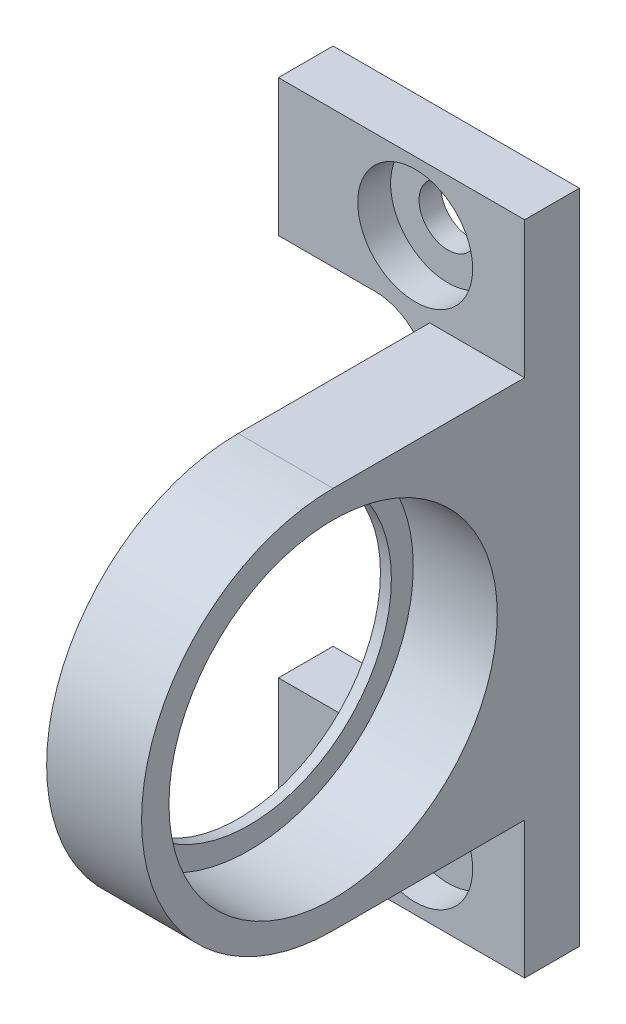
ISO-10303-21;
HEADER;
FILE_DESCRIPTION(('STEP AP214'),'2;1');
FILE_NAME('part.step','',(''),(''),'','','');
FILE_SCHEMA(('AUTOMOTIVE_DESIGN { 1 0 10303 214 1 1 1 1 }'));
ENDSEC;
DATA;
#1=APPLICATION_CONTEXT('core data for automotive mechanical design processes');
#2=APPLICATION_PROTOCOL_DEFINITION('international standard','automotive_design',2000,#1);
#3=PRODUCT_CONTEXT('',#1,'mechanical');
#4=PRODUCT('Part','Part','',(#3));
#5=PRODUCT_RELATED_PRODUCT_CATEGORY('part','',(#4));
#6=PRODUCT_DEFINITION_FORMATION('','',#4);
#7=PRODUCT_DEFINITION_CONTEXT('part definition',#1,'design');
#8=PRODUCT_DEFINITION('design','',#6,#7);
#9=PRODUCT_DEFINITION_SHAPE('','',#8);
#10=(LENGTH_UNIT() NAMED_UNIT(*) SI_UNIT(.MILLI.,.METRE.));
#11=(NAMED_UNIT(*) PLANE_ANGLE_UNIT() SI_UNIT($,.RADIAN.));
#12=(NAMED_UNIT(*) SI_UNIT($,.STERADIAN.) SOLID_ANGLE_UNIT());
#13=UNCERTAINTY_MEASURE_WITH_UNIT(LENGTH_MEASURE(1.E-05),#10,'distance_accuracy_value','');
#14=(GEOMETRIC_REPRESENTATION_CONTEXT(3) GLOBAL_UNCERTAINTY_ASSIGNED_CONTEXT((#13)) GLOBAL_UNIT_ASSIGNED_CONTEXT((#10,
#11,#12)) REPRESENTATION_CONTEXT('',''));
#15=CARTESIAN_POINT('',(0.,0.,0.));
#16=DIRECTION('',(0.,0.,1.));
#17=DIRECTION('',(1.,0.,0.));
#18=AXIS2_PLACEMENT_3D('',#15,#16,#17);
#19=CARTESIAN_POINT('',(7.72642356527553,24.3382352941177,-0.00999999999999959));
#20=DIRECTION('',(-1.,0.,0.));
#21=DIRECTION('',(0.,-1.,0.));
#22=AXIS2_PLACEMENT_3D('',#19,#20,#21);
#23=PLANE('',#22);
#24=DIRECTION('',(0.,-1.,0.));
#25=VECTOR('',#24,1.);
#26=CARTESIAN_POINT('',(7.72642356527553,0.,5.));
#27=LINE('',#26,#25);
#28=CARTESIAN_POINT('',(7.72642356527553,24.3382352941177,5.));
#29=VERTEX_POINT('',#28);
#30=CARTESIAN_POINT('',(7.72642356527553,11.8382352941177,5.));
#31=VERTEX_POINT('',#30);
#32=EDGE_CURVE('E229',#29,#31,#27,.T.);
#33=ORIENTED_EDGE('',*,*,#32,.F.);
#34=DIRECTION('',(0.,0.,-1.));
#35=VECTOR('',#34,1.);
#36=CARTESIAN_POINT('',(7.72642356527553,24.3382352941177,5.));
#37=LINE('',#36,#35);
#38=CARTESIAN_POINT('',(7.72642356527552,24.3382352941177,0.));
#39=VERTEX_POINT('',#38);
#40=EDGE_CURVE('E179',#29,#39,#37,.T.);
#41=ORIENTED_EDGE('',*,*,#40,.T.);
#42=DIRECTION('',(0.,-1.,0.));
#43=VECTOR('',#42,1.);
#44=CARTESIAN_POINT('',(7.72642356527553,0.,0.));
#45=LINE('',#44,#43);
#46=CARTESIAN_POINT('',(7.72642356527552,11.8382352941177,0.));
#47=VERTEX_POINT('',#46);
#48=EDGE_CURVE('E180',#39,#47,#45,.T.);
#49=ORIENTED_EDGE('',*,*,#48,.T.);
#50=DIRECTION('',(0.,0.,1.));
#51=VECTOR('',#50,1.);
#52=CARTESIAN_POINT('',(7.72642356527553,11.8382352941177,5.));
#53=LINE('',#52,#51);
#54=EDGE_CURVE('E232',#47,#31,#53,.T.);
#55=ORIENTED_EDGE('',*,*,#54,.T.);
#56=EDGE_LOOP('',(#33,#41,#49,#55));
#57=FACE_BOUND('',#56,.T.);
#58=ADVANCED_FACE('F53',(#57),#23,.T.);
#59=DIRECTION('',(0.,-1.,0.));
#60=VECTOR('',#59,1.);
#61=CARTESIAN_POINT('',(7.72642356527553,0.,5.));
#62=LINE('',#61,#60);
#63=CARTESIAN_POINT('',(7.72642356527552,-23.1617647058823,5.));
#64=VERTEX_POINT('',#63);
#65=CARTESIAN_POINT('',(7.72642356527552,-35.6617647058823,5.));
#66=VERTEX_POINT('',#65);
#67=EDGE_CURVE('E226',#64,#66,#62,.T.);
#68=ORIENTED_EDGE('',*,*,#67,.F.);
#69=DIRECTION('',(0.,0.,-1.));
#70=VECTOR('',#69,1.);
#71=CARTESIAN_POINT('',(7.72642356527552,-23.1617647058823,5.));
#72=LINE('',#71,#70);
#73=CARTESIAN_POINT('',(7.72642356527552,-23.1617647058823,0.));
#74=VERTEX_POINT('',#73);
#75=EDGE_CURVE('E185',#64,#74,#72,.T.);
#76=ORIENTED_EDGE('',*,*,#75,.T.);
#77=CARTESIAN_POINT('',(7.72642356527552,-35.6617647058823,0.));
#78=VERTEX_POINT('',#77);
#79=EDGE_CURVE('E162',#74,#78,#45,.T.);
#80=ORIENTED_EDGE('',*,*,#79,.T.);
#81=DIRECTION('',(0.,0.,1.));
#82=VECTOR('',#81,1.);
#83=CARTESIAN_POINT('',(7.72642356527552,-35.6617647058823,5.));
#84=LINE('',#83,#82);
#85=EDGE_CURVE('E173',#78,#66,#84,.T.);
#86=ORIENTED_EDGE('',*,*,#85,.T.);
#87=EDGE_LOOP('',(#68,#76,#80,#86));
#88=FACE_BOUND('',#87,.T.);
#89=ADVANCED_FACE('F183',(#88),#23,.T.);
#90=CARTESIAN_POINT('',(0.,0.,5.));
#91=DIRECTION('',(0.,0.,1.));
#92=DIRECTION('',(1.,0.,0.));
#93=AXIS2_PLACEMENT_3D('',#90,#91,#92);
#94=PLANE('',#93);
#95=CARTESIAN_POINT('',(20.2264235652755,18.0882352941177,5.));
#96=DIRECTION('',(0.,0.,1.));
#97=DIRECTION('',(1.,0.,0.));
#98=AXIS2_PLACEMENT_3D('',#95,#96,#97);
#99=CIRCLE('',#98,5.25);
#100=CARTESIAN_POINT('',(25.4764235652755,18.0882352941177,5.));
#101=VERTEX_POINT('',#100);
#102=EDGE_CURVE('E559',#101,#101,#99,.T.);
#103=ORIENTED_EDGE('',*,*,#102,.F.);
#104=EDGE_LOOP('',(#103));
#105=FACE_BOUND('',#104,.T.);
#106=DIRECTION('',(-1.,0.,0.));
#107=VECTOR('',#106,1.);
#108=CARTESIAN_POINT('',(0.,24.3382352941177,5.));
#109=LINE('',#108,#107);
#110=CARTESIAN_POINT('',(30.2264235652755,24.3382352941177,5.));
#111=VERTEX_POINT('',#110);
#112=EDGE_CURVE('E200',#111,#29,#109,.T.);
#113=ORIENTED_EDGE('',*,*,#112,.T.);
#114=ORIENTED_EDGE('',*,*,#32,.T.);
#115=DIRECTION('',(1.,0.,0.));
#116=VECTOR('',#115,1.);
#117=CARTESIAN_POINT('',(0.,11.8382352941177,5.));
#118=LINE('',#117,#116);
#119=CARTESIAN_POINT('',(16.5499529770402,11.8382352941177,5.));
#120=VERTEX_POINT('',#119);
#121=EDGE_CURVE('E196',#31,#120,#118,.T.);
#122=ORIENTED_EDGE('',*,*,#121,.T.);
#123=CARTESIAN_POINT('',(16.5499529770402,6.83823529411772,5.));
#124=DIRECTION('',(0.,0.,1.));
#125=DIRECTION('',(1.,0.,0.));
#126=AXIS2_PLACEMENT_3D('',#123,#124,#125);
#127=CIRCLE('',#126,5.);
#128=CARTESIAN_POINT('',(21.5499529770402,6.83823529411772,5.));
#129=VERTEX_POINT('',#128);
#130=EDGE_CURVE('E289',#120,#129,#127,.F.);
#131=ORIENTED_EDGE('',*,*,#130,.T.);
#132=DIRECTION('',(0.,-1.,0.));
#133=VECTOR('',#132,1.);
#134=CARTESIAN_POINT('',(21.5499529770402,0.,5.));
#135=LINE('',#134,#133);
#136=CARTESIAN_POINT('',(21.5499529770402,11.8382352941177,5.));
#137=VERTEX_POINT('',#136);
#138=EDGE_CURVE('E288',#137,#129,#135,.T.);
#139=ORIENTED_EDGE('',*,*,#138,.F.);
#140=DIRECTION('',(-1.,0.,0.));
#141=VECTOR('',#140,1.);
#142=CARTESIAN_POINT('',(30.2264235652755,11.8382352941177,5.));
#143=LINE('',#142,#141);
#144=CARTESIAN_POINT('',(30.2264235652755,11.8382352941177,5.));
#145=VERTEX_POINT('',#144);
#146=EDGE_CURVE('E214',#145,#137,#143,.T.);
#147=ORIENTED_EDGE('',*,*,#146,.F.);
#148=DIRECTION('',(0.,-1.,0.));
#149=VECTOR('',#148,1.);
#150=CARTESIAN_POINT('',(30.2264235652755,0.,5.));
#151=LINE('',#150,#149);
#152=EDGE_CURVE('E202',#111,#145,#151,.T.);
#153=ORIENTED_EDGE('',*,*,#152,.F.);
#154=EDGE_LOOP('',(#113,#114,#122,#131,#139,#147,#153));
#155=FACE_BOUND('',#154,.T.);
#156=ADVANCED_FACE('F252',(#105,#155),#94,.T.);
#157=CARTESIAN_POINT('',(20.2264235652755,-29.4117647058823,5.));
#158=DIRECTION('',(0.,0.,1.));
#159=DIRECTION('',(1.,0.,0.));
#160=AXIS2_PLACEMENT_3D('',#157,#158,#159);
#161=CIRCLE('',#160,5.25);
#162=CARTESIAN_POINT('',(25.4764235652755,-29.4117647058823,5.));
#163=VERTEX_POINT('',#162);
#164=EDGE_CURVE('E549',#163,#163,#161,.T.);
#165=ORIENTED_EDGE('',*,*,#164,.F.);
#166=EDGE_LOOP('',(#165));
#167=FACE_BOUND('',#166,.T.);
#168=DIRECTION('',(-1.,0.,0.));
#169=VECTOR('',#168,1.);
#170=CARTESIAN_POINT('',(0.,-23.1617647058823,5.));
#171=LINE('',#170,#169);
#172=CARTESIAN_POINT('',(16.5499529770402,-23.1617647058823,5.));
#173=VERTEX_POINT('',#172);
#174=EDGE_CURVE('E194',#173,#64,#171,.T.);
#175=ORIENTED_EDGE('',*,*,#174,.T.);
#176=ORIENTED_EDGE('',*,*,#67,.T.);
#177=DIRECTION('',(1.,0.,0.));
#178=VECTOR('',#177,1.);
#179=CARTESIAN_POINT('',(0.,-35.6617647058823,5.));
#180=LINE('',#179,#178);
#181=CARTESIAN_POINT('',(30.2264235652755,-35.6617647058823,5.));
#182=VERTEX_POINT('',#181);
#183=EDGE_CURVE('E175',#66,#182,#180,.T.);
#184=ORIENTED_EDGE('',*,*,#183,.T.);
#185=CARTESIAN_POINT('',(30.2264235652755,-23.1617647058823,5.));
#186=VERTEX_POINT('',#185);
#187=EDGE_CURVE('E206',#186,#182,#151,.T.);
#188=ORIENTED_EDGE('',*,*,#187,.F.);
#189=DIRECTION('',(1.,0.,0.));
#190=VECTOR('',#189,1.);
#191=CARTESIAN_POINT('',(30.2264235652755,-23.1617647058823,5.));
#192=LINE('',#191,#190);
#193=CARTESIAN_POINT('',(21.5499529770402,-23.1617647058823,5.));
#194=VERTEX_POINT('',#193);
#195=EDGE_CURVE('E217',#194,#186,#192,.T.);
#196=ORIENTED_EDGE('',*,*,#195,.F.);
#197=DIRECTION('',(0.,-1.,0.));
#198=VECTOR('',#197,1.);
#199=CARTESIAN_POINT('',(21.5499529770402,0.,5.));
#200=LINE('',#199,#198);
#201=CARTESIAN_POINT('',(21.5499529770402,-18.1617647058823,5.));
#202=VERTEX_POINT('',#201);
#203=EDGE_CURVE('E261',#202,#194,#200,.T.);
#204=ORIENTED_EDGE('',*,*,#203,.F.);
#205=CARTESIAN_POINT('',(16.5499529770402,-18.1617647058823,5.));
#206=DIRECTION('',(0.,0.,1.));
#207=DIRECTION('',(1.,0.,0.));
#208=AXIS2_PLACEMENT_3D('',#205,#206,#207);
#209=CIRCLE('',#208,5.);
#210=EDGE_CURVE('E569',#202,#173,#209,.F.);
#211=ORIENTED_EDGE('',*,*,#210,.T.);
#212=EDGE_LOOP('',(#175,#176,#184,#188,#196,#204,#211));
#213=FACE_BOUND('',#212,.T.);
#214=ADVANCED_FACE('F281',(#167,#213),#94,.T.);
#215=CARTESIAN_POINT('',(0.,11.8382352941177,5.));
#216=DIRECTION('',(0.,1.,0.));
#217=DIRECTION('',(-1.,0.,0.));
#218=AXIS2_PLACEMENT_3D('',#215,#216,#217);
#219=PLANE('',#218);
#220=ORIENTED_EDGE('',*,*,#54,.F.);
#221=DIRECTION('',(1.,0.,0.));
#222=VECTOR('',#221,1.);
#223=CARTESIAN_POINT('',(0.,11.8382352941177,0.));
#224=LINE('',#223,#222);
#225=CARTESIAN_POINT('',(16.5499529770402,11.8382352941177,0.));
#226=VERTEX_POINT('',#225);
#227=EDGE_CURVE('E170',#47,#226,#224,.T.);
#228=ORIENTED_EDGE('',*,*,#227,.T.);
#229=DIRECTION('',(0.,0.,-1.));
#230=VECTOR('',#229,1.);
#231=CARTESIAN_POINT('',(16.5499529770402,11.8382352941177,5.));
#232=LINE('',#231,#230);
#233=EDGE_CURVE('E249',#226,#120,#232,.F.);
#234=ORIENTED_EDGE('',*,*,#233,.T.);
#235=ORIENTED_EDGE('',*,*,#121,.F.);
#236=EDGE_LOOP('',(#220,#228,#234,#235));
#237=FACE_BOUND('',#236,.T.);
#238=ADVANCED_FACE('F248',(#237),#219,.F.);
#239=CARTESIAN_POINT('',(0.,-23.1617647058823,5.));
#240=DIRECTION('',(0.,-1.,0.));
#241=DIRECTION('',(1.,0.,0.));
#242=AXIS2_PLACEMENT_3D('',#239,#240,#241);
#243=PLANE('',#242);
#244=ORIENTED_EDGE('',*,*,#75,.F.);
#245=ORIENTED_EDGE('',*,*,#174,.F.);
#246=DIRECTION('',(0.,0.,-1.));
#247=VECTOR('',#246,1.);
#248=CARTESIAN_POINT('',(16.5499529770402,-23.1617647058823,5.));
#249=LINE('',#248,#247);
#250=CARTESIAN_POINT('',(16.5499529770402,-23.1617647058823,0.));
#251=VERTEX_POINT('',#250);
#252=EDGE_CURVE('E575',#173,#251,#249,.T.);
#253=ORIENTED_EDGE('',*,*,#252,.T.);
#254=DIRECTION('',(-1.,0.,0.));
#255=VECTOR('',#254,1.);
#256=CARTESIAN_POINT('',(0.,-23.1617647058823,0.));
#257=LINE('',#256,#255);
#258=EDGE_CURVE('E203',#251,#74,#257,.T.);
#259=ORIENTED_EDGE('',*,*,#258,.T.);
#260=EDGE_LOOP('',(#244,#245,#253,#259));
#261=FACE_BOUND('',#260,.T.);
#262=ADVANCED_FACE('F336',(#261),#243,.F.);
#263=CARTESIAN_POINT('',(0.,24.3382352941177,5.));
#264=DIRECTION('',(0.,-1.,0.));
#265=DIRECTION('',(0.,0.,-1.));
#266=AXIS2_PLACEMENT_3D('',#263,#264,#265);
#267=PLANE('',#266);
#268=ORIENTED_EDGE('',*,*,#40,.F.);
#269=ORIENTED_EDGE('',*,*,#112,.F.);
#270=DIRECTION('',(0.,0.,-1.));
#271=VECTOR('',#270,1.);
#272=CARTESIAN_POINT('',(30.2264235652755,24.3382352941177,5.));
#273=LINE('',#272,#271);
#274=CARTESIAN_POINT('',(30.2264235652755,24.3382352941177,0.));
#275=VERTEX_POINT('',#274);
#276=EDGE_CURVE('E257',#111,#275,#273,.T.);
#277=ORIENTED_EDGE('',*,*,#276,.T.);
#278=DIRECTION('',(-1.,0.,0.));
#279=VECTOR('',#278,1.);
#280=CARTESIAN_POINT('',(0.,24.3382352941177,0.));
#281=LINE('',#280,#279);
#282=EDGE_CURVE('E169',#275,#39,#281,.T.);
#283=ORIENTED_EDGE('',*,*,#282,.T.);
#284=EDGE_LOOP('',(#268,#269,#277,#283));
#285=FACE_BOUND('',#284,.T.);
#286=ADVANCED_FACE('F256',(#285),#267,.F.);
#287=CARTESIAN_POINT('',(0.,-35.6617647058823,5.));
#288=DIRECTION('',(0.,1.,0.));
#289=DIRECTION('',(0.,0.,1.));
#290=AXIS2_PLACEMENT_3D('',#287,#288,#289);
#291=PLANE('',#290);
#292=ORIENTED_EDGE('',*,*,#85,.F.);
#293=DIRECTION('',(1.,0.,0.));
#294=VECTOR('',#293,1.);
#295=CARTESIAN_POINT('',(0.,-35.6617647058823,0.));
#296=LINE('',#295,#294);
#297=CARTESIAN_POINT('',(30.2264235652755,-35.6617647058823,0.));
#298=VERTEX_POINT('',#297);
#299=EDGE_CURVE('E157',#78,#298,#296,.T.);
#300=ORIENTED_EDGE('',*,*,#299,.T.);
#301=DIRECTION('',(0.,0.,-1.));
#302=VECTOR('',#301,1.);
#303=CARTESIAN_POINT('',(30.2264235652755,-35.6617647058823,5.));
#304=LINE('',#303,#302);
#305=EDGE_CURVE('E197',#182,#298,#304,.T.);
#306=ORIENTED_EDGE('',*,*,#305,.F.);
#307=ORIENTED_EDGE('',*,*,#183,.F.);
#308=EDGE_LOOP('',(#292,#300,#306,#307));
#309=FACE_BOUND('',#308,.T.);
#310=ADVANCED_FACE('F174',(#309),#291,.F.);
#311=CARTESIAN_POINT('',(0.,0.,0.));
#312=DIRECTION('',(0.,0.,1.));
#313=DIRECTION('',(1.,0.,0.));
#314=AXIS2_PLACEMENT_3D('',#311,#312,#313);
#315=PLANE('',#314);
#316=CARTESIAN_POINT('',(20.2264235652755,-29.4117647058823,0.));
#317=DIRECTION('',(0.,0.,1.));
#318=DIRECTION('',(1.,0.,0.));
#319=AXIS2_PLACEMENT_3D('',#316,#317,#318);
#320=CIRCLE('',#319,2.65);
#321=CARTESIAN_POINT('',(22.8764235652755,-29.4117647058823,0.));
#322=VERTEX_POINT('',#321);
#323=EDGE_CURVE('E556',#322,#322,#320,.T.);
#324=ORIENTED_EDGE('',*,*,#323,.T.);
#325=EDGE_LOOP('',(#324));
#326=FACE_BOUND('',#325,.T.);
#327=CARTESIAN_POINT('',(20.2264235652755,18.0882352941177,0.));
#328=DIRECTION('',(0.,0.,1.));
#329=DIRECTION('',(1.,0.,0.));
#330=AXIS2_PLACEMENT_3D('',#327,#328,#329);
#331=CIRCLE('',#330,2.65);
#332=CARTESIAN_POINT('',(22.8764235652755,18.0882352941177,0.));
#333=VERTEX_POINT('',#332);
#334=EDGE_CURVE('E186',#333,#333,#331,.T.);
#335=ORIENTED_EDGE('',*,*,#334,.T.);
#336=EDGE_LOOP('',(#335));
#337=FACE_BOUND('',#336,.T.);
#338=ORIENTED_EDGE('',*,*,#48,.F.);
#339=ORIENTED_EDGE('',*,*,#282,.F.);
#340=DIRECTION('',(0.,-1.,0.));
#341=VECTOR('',#340,1.);
#342=CARTESIAN_POINT('',(30.2264235652755,0.,0.));
#343=LINE('',#342,#341);
#344=EDGE_CURVE('E165',#275,#298,#343,.T.);
#345=ORIENTED_EDGE('',*,*,#344,.T.);
#346=ORIENTED_EDGE('',*,*,#299,.F.);
#347=ORIENTED_EDGE('',*,*,#79,.F.);
#348=ORIENTED_EDGE('',*,*,#258,.F.);
#349=CARTESIAN_POINT('',(16.5499529770402,-18.1617647058823,0.));
#350=DIRECTION('',(0.,0.,1.));
#351=DIRECTION('',(1.,0.,0.));
#352=AXIS2_PLACEMENT_3D('',#349,#350,#351);
#353=CIRCLE('',#352,5.);
#354=CARTESIAN_POINT('',(21.5499529770402,-18.1617647058823,0.));
#355=VERTEX_POINT('',#354);
#356=EDGE_CURVE('E571',#251,#355,#353,.T.);
#357=ORIENTED_EDGE('',*,*,#356,.T.);
#358=DIRECTION('',(0.,1.,0.));
#359=VECTOR('',#358,1.);
#360=CARTESIAN_POINT('',(21.5499529770402,0.,0.));
#361=LINE('',#360,#359);
#362=CARTESIAN_POINT('',(21.5499529770402,6.83823529411772,0.));
#363=VERTEX_POINT('',#362);
#364=EDGE_CURVE('E205',#355,#363,#361,.T.);
#365=ORIENTED_EDGE('',*,*,#364,.T.);
#366=CARTESIAN_POINT('',(16.5499529770402,6.83823529411772,0.));
#367=DIRECTION('',(0.,0.,1.));
#368=DIRECTION('',(1.,0.,0.));
#369=AXIS2_PLACEMENT_3D('',#366,#367,#368);
#370=CIRCLE('',#369,5.);
#371=EDGE_CURVE('E244',#363,#226,#370,.T.);
#372=ORIENTED_EDGE('',*,*,#371,.T.);
#373=ORIENTED_EDGE('',*,*,#227,.F.);
#374=EDGE_LOOP('',(#338,#339,#345,#346,#347,#348,#357,#365,#372,#373));
#375=FACE_BOUND('',#374,.T.);
#376=ADVANCED_FACE('F55',(#326,#337,#375),#315,.F.);
#377=CARTESIAN_POINT('',(30.2264235652755,-5.66176470588227,22.5));
#378=DIRECTION('',(-1.,0.,0.));
#379=DIRECTION('',(0.,0.,1.));
#380=AXIS2_PLACEMENT_3D('',#377,#378,#379);
#381=CYLINDRICAL_SURFACE('',#380,15.);
#382=CARTESIAN_POINT('',(30.2264235652755,-5.66176470588227,22.5));
#383=DIRECTION('',(-1.,0.,0.));
#384=DIRECTION('',(0.,0.,1.));
#385=AXIS2_PLACEMENT_3D('',#382,#383,#384);
#386=CIRCLE('',#385,15.);
#387=CARTESIAN_POINT('',(30.2264235652755,-5.66176470588227,37.5));
#388=VERTEX_POINT('',#387);
#389=EDGE_CURVE('E221',#388,#388,#386,.T.);
#390=CARTESIAN_POINT('',(22.5499529770402,-5.66176470588227,22.5));
#391=DIRECTION('',(-1.,0.,0.));
#392=DIRECTION('',(0.,0.,1.));
#393=AXIS2_PLACEMENT_3D('',#390,#391,#392);
#394=CIRCLE('',#393,15.);
#395=CARTESIAN_POINT('',(22.5499529770402,-5.66176470588227,37.5));
#396=VERTEX_POINT('',#395);
#397=EDGE_CURVE('E228',#396,#396,#394,.F.);
#398=CARTESIAN_POINT('',(30.2264235652755,-5.66176470588227,37.5));
#399=CARTESIAN_POINT('',(30.1464603299814,-5.66176470588227,37.5));
#400=CARTESIAN_POINT('',(30.0664970946873,-5.66176470588227,37.5));
#401=CARTESIAN_POINT('',(29.9065706240991,-5.66176470588227,37.5));
#402=CARTESIAN_POINT('',(29.8266073888049,-5.66176470588227,37.5));
#403=CARTESIAN_POINT('',(29.6666809182167,-5.66176470588227,37.5));
#404=CARTESIAN_POINT('',(29.5867176829226,-5.66176470588227,37.5));
#405=CARTESIAN_POINT('',(29.4267912123343,-5.66176470588227,37.5));
#406=CARTESIAN_POINT('',(29.3468279770402,-5.66176470588227,37.5));
#407=CARTESIAN_POINT('',(29.186901506452,-5.66176470588227,37.5));
#408=CARTESIAN_POINT('',(29.1069382711579,-5.66176470588227,37.5));
#409=CARTESIAN_POINT('',(28.9470118005696,-5.66176470588227,37.5));
#410=CARTESIAN_POINT('',(28.8670485652755,-5.66176470588227,37.5));
#411=CARTESIAN_POINT('',(28.7071220946873,-5.66176470588227,37.5));
#412=CARTESIAN_POINT('',(28.6271588593932,-5.66176470588227,37.5));
#413=CARTESIAN_POINT('',(28.4672323888049,-5.66176470588227,37.5));
#414=CARTESIAN_POINT('',(28.3872691535108,-5.66176470588227,37.5));
#415=CARTESIAN_POINT('',(28.2273426829226,-5.66176470588227,37.5));
#416=CARTESIAN_POINT('',(28.1473794476285,-5.66176470588227,37.5));
#417=CARTESIAN_POINT('',(27.9874529770402,-5.66176470588227,37.5));
#418=CARTESIAN_POINT('',(27.9074897417461,-5.66176470588227,37.5));
#419=CARTESIAN_POINT('',(27.7475632711579,-5.66176470588227,37.5));
#420=CARTESIAN_POINT('',(27.6676000358638,-5.66176470588227,37.5));
#421=CARTESIAN_POINT('',(27.5076735652755,-5.66176470588227,37.5));
#422=CARTESIAN_POINT('',(27.4277103299814,-5.66176470588227,37.5));
#423=CARTESIAN_POINT('',(27.2677838593932,-5.66176470588227,37.5));
#424=CARTESIAN_POINT('',(27.187820624099,-5.66176470588227,37.5));
#425=CARTESIAN_POINT('',(27.0278941535108,-5.66176470588227,37.5));
#426=CARTESIAN_POINT('',(26.9479309182167,-5.66176470588227,37.5));
#427=CARTESIAN_POINT('',(26.7880044476285,-5.66176470588227,37.5));
#428=CARTESIAN_POINT('',(26.7080412123343,-5.66176470588227,37.5));
#429=CARTESIAN_POINT('',(26.5481147417461,-5.66176470588227,37.5));
#430=CARTESIAN_POINT('',(26.468151506452,-5.66176470588227,37.5));
#431=CARTESIAN_POINT('',(26.3082250358637,-5.66176470588227,37.5));
#432=CARTESIAN_POINT('',(26.2282618005696,-5.66176470588227,37.5));
#433=CARTESIAN_POINT('',(26.0683353299814,-5.66176470588227,37.5));
#434=CARTESIAN_POINT('',(25.9883720946873,-5.66176470588227,37.5));
#435=CARTESIAN_POINT('',(25.828445624099,-5.66176470588227,37.5));
#436=CARTESIAN_POINT('',(25.7484823888049,-5.66176470588227,37.5));
#437=CARTESIAN_POINT('',(25.5885559182167,-5.66176470588227,37.5));
#438=CARTESIAN_POINT('',(25.5085926829226,-5.66176470588227,37.5));
#439=CARTESIAN_POINT('',(25.3486662123343,-5.66176470588227,37.5));
#440=CARTESIAN_POINT('',(25.2687029770402,-5.66176470588227,37.5));
#441=CARTESIAN_POINT('',(25.108776506452,-5.66176470588227,37.5));
#442=CARTESIAN_POINT('',(25.0288132711579,-5.66176470588227,37.5));
#443=CARTESIAN_POINT('',(24.8688868005696,-5.66176470588227,37.5));
#444=CARTESIAN_POINT('',(24.7889235652755,-5.66176470588227,37.5));
#445=CARTESIAN_POINT('',(24.6289970946873,-5.66176470588227,37.5));
#446=CARTESIAN_POINT('',(24.5490338593932,-5.66176470588227,37.5));
#447=CARTESIAN_POINT('',(24.3891073888049,-5.66176470588227,37.5));
#448=CARTESIAN_POINT('',(24.3091441535108,-5.66176470588227,37.5));
#449=CARTESIAN_POINT('',(24.1492176829226,-5.66176470588227,37.5));
#450=CARTESIAN_POINT('',(24.0692544476284,-5.66176470588227,37.5));
#451=CARTESIAN_POINT('',(23.9093279770402,-5.66176470588227,37.5));
#452=CARTESIAN_POINT('',(23.8293647417461,-5.66176470588227,37.5));
#453=CARTESIAN_POINT('',(23.6694382711579,-5.66176470588227,37.5));
#454=CARTESIAN_POINT('',(23.5894750358637,-5.66176470588227,37.5));
#455=CARTESIAN_POINT('',(23.4295485652755,-5.66176470588227,37.5));
#456=CARTESIAN_POINT('',(23.3495853299814,-5.66176470588227,37.5));
#457=CARTESIAN_POINT('',(23.1896588593932,-5.66176470588227,37.5));
#458=CARTESIAN_POINT('',(23.109695624099,-5.66176470588227,37.5));
#459=CARTESIAN_POINT('',(22.9497691535108,-5.66176470588227,37.5));
#460=CARTESIAN_POINT('',(22.8698059182167,-5.66176470588227,37.5));
#461=CARTESIAN_POINT('',(22.7098794476284,-5.66176470588227,37.5));
#462=CARTESIAN_POINT('',(22.6299162123343,-5.66176470588227,37.5));
#463=CARTESIAN_POINT('',(22.5499529770402,-5.66176470588227,37.5));
#464=B_SPLINE_CURVE_WITH_KNOTS('',3,(#398,#399,#400,#401,#402,#403,#404,#405,#406,#407,#408,
#409,#410,#411,#412,#413,#414,#415,#416,#417,#418,#419,#420,#421,#422,#423,#424,#425,#426,#427,
#428,#429,#430,#431,#432,#433,#434,#435,#436,#437,#438,#439,#440,#441,#442,#443,#444,#445,#446,
#447,#448,#449,#450,#451,#452,#453,#454,#455,#456,#457,#458,#459,#460,#461,#462,#463),
.UNSPECIFIED.,.F.,.F.,(4,2,2,2,2,2,2,2,2,2,2,2,2,2,2,2,2,2,2,2,2,2,2,2,2,2,2,2,2,2,2,2,4),(0.,
0.239889705882356,0.479779411764709,0.719669117647061,0.959558823529414,1.19944852941177,
1.43933823529412,1.67922794117648,1.91911764705883,2.15900735294118,2.39889705882354,
2.63878676470589,2.87867647058824,3.1185661764706,3.35845588235295,3.5983455882353,
3.83823529411766,4.07812500000001,4.31801470588236,4.55790441176472,4.79779411764707,
5.03768382352942,5.27757352941178,5.51746323529413,5.75735294117648,5.99724264705884,
6.23713235294119,6.47702205882355,6.7169117647059,6.95680147058825,7.19669117647061,
7.43658088235296,7.67647058823531),.UNSPECIFIED.);
#465=EDGE_CURVE('BSEAM298',#388,#396,#464,.T.);
#466=ORIENTED_EDGE('',*,*,#389,.F.);
#467=ORIENTED_EDGE('',*,*,#397,.F.);
#468=ORIENTED_EDGE('',*,*,#465,.T.);
#469=ORIENTED_EDGE('',*,*,#465,.F.);
#470=EDGE_LOOP('',(#466,#468,#467,#469));
#471=FACE_BOUND('',#470,.T.);
#472=ADVANCED_FACE('F298',(#471),#381,.F.);
#473=CARTESIAN_POINT('',(21.5499529770402,0.,5.));
#474=DIRECTION('',(-1.,0.,0.));
#475=DIRECTION('',(0.,0.,1.));
#476=AXIS2_PLACEMENT_3D('',#473,#474,#475);
#477=PLANE('',#476);
#478=ORIENTED_EDGE('',*,*,#138,.T.);
#479=DIRECTION('',(0.,0.,-1.));
#480=VECTOR('',#479,1.);
#481=CARTESIAN_POINT('',(21.5499529770402,6.83823529411772,5.));
#482=LINE('',#481,#480);
#483=EDGE_CURVE('E293',#129,#363,#482,.T.);
#484=ORIENTED_EDGE('',*,*,#483,.T.);
#485=ORIENTED_EDGE('',*,*,#364,.F.);
#486=DIRECTION('',(0.,0.,-1.));
#487=VECTOR('',#486,1.);
#488=CARTESIAN_POINT('',(21.5499529770402,-18.1617647058823,5.));
#489=LINE('',#488,#487);
#490=EDGE_CURVE('E292',#355,#202,#489,.F.);
#491=ORIENTED_EDGE('',*,*,#490,.T.);
#492=ORIENTED_EDGE('',*,*,#203,.T.);
#493=DIRECTION('',(0.,0.,-1.));
#494=VECTOR('',#493,1.);
#495=CARTESIAN_POINT('',(21.5499529770402,-23.1617647058823,40.));
#496=LINE('',#495,#494);
#497=CARTESIAN_POINT('',(21.5499529770402,-23.1617647058823,22.5));
#498=VERTEX_POINT('',#497);
#499=EDGE_CURVE('E272',#498,#194,#496,.T.);
#500=ORIENTED_EDGE('',*,*,#499,.F.);
#501=CARTESIAN_POINT('',(21.5499529770402,-5.66176470588227,22.5));
#502=DIRECTION('',(-1.,0.,0.));
#503=DIRECTION('',(0.,0.,1.));
#504=AXIS2_PLACEMENT_3D('',#501,#502,#503);
#505=CIRCLE('',#504,17.5);
#506=CARTESIAN_POINT('',(21.5499529770402,11.8382352941177,22.5));
#507=VERTEX_POINT('',#506);
#508=EDGE_CURVE('E78',#498,#507,#505,.T.);
#509=ORIENTED_EDGE('',*,*,#508,.T.);
#510=DIRECTION('',(0.,0.,-1.));
#511=VECTOR('',#510,1.);
#512=CARTESIAN_POINT('',(21.5499529770402,11.8382352941177,40.));
#513=LINE('',#512,#511);
#514=EDGE_CURVE('E270',#507,#137,#513,.T.);
#515=ORIENTED_EDGE('',*,*,#514,.T.);
#516=EDGE_LOOP('',(#478,#484,#485,#491,#492,#500,#509,#515));
#517=FACE_BOUND('',#516,.T.);
#518=CARTESIAN_POINT('',(21.5499529770402,-5.66176470588227,22.5));
#519=DIRECTION('',(-1.,0.,0.));
#520=DIRECTION('',(0.,0.,1.));
#521=AXIS2_PLACEMENT_3D('',#518,#519,#520);
#522=CIRCLE('',#521,13.);
#523=CARTESIAN_POINT('',(21.5499529770402,-5.66176470588227,35.5));
#524=VERTEX_POINT('',#523);
#525=EDGE_CURVE('E12',#524,#524,#522,.T.);
#526=ORIENTED_EDGE('',*,*,#525,.F.);
#527=EDGE_LOOP('',(#526));
#528=FACE_BOUND('',#527,.T.);
#529=ADVANCED_FACE('F295',(#517,#528),#477,.T.);
#530=CARTESIAN_POINT('',(30.2264235652755,0.,5.));
#531=DIRECTION('',(1.,0.,0.));
#532=DIRECTION('',(0.,0.,-1.));
#533=AXIS2_PLACEMENT_3D('',#530,#531,#532);
#534=PLANE('',#533);
#535=ORIENTED_EDGE('',*,*,#389,.T.);
#536=EDGE_LOOP('',(#535));
#537=FACE_BOUND('',#536,.T.);
#538=DIRECTION('',(0.,0.,-1.));
#539=VECTOR('',#538,1.);
#540=CARTESIAN_POINT('',(30.2264235652755,11.8382352941177,40.));
#541=LINE('',#540,#539);
#542=CARTESIAN_POINT('',(30.2264235652755,11.8382352941177,22.5));
#543=VERTEX_POINT('',#542);
#544=EDGE_CURVE('E267',#543,#145,#541,.T.);
#545=ORIENTED_EDGE('',*,*,#544,.F.);
#546=CARTESIAN_POINT('',(30.2264235652755,-5.66176470588227,22.5));
#547=DIRECTION('',(-1.,0.,0.));
#548=DIRECTION('',(0.,0.,1.));
#549=AXIS2_PLACEMENT_3D('',#546,#547,#548);
#550=CIRCLE('',#549,17.5);
#551=CARTESIAN_POINT('',(30.2264235652755,-23.1617647058823,22.5));
#552=VERTEX_POINT('',#551);
#553=EDGE_CURVE('E70',#552,#543,#550,.T.);
#554=ORIENTED_EDGE('',*,*,#553,.F.);
#555=DIRECTION('',(0.,0.,-1.));
#556=VECTOR('',#555,1.);
#557=CARTESIAN_POINT('',(30.2264235652755,-23.1617647058823,40.));
#558=LINE('',#557,#556);
#559=EDGE_CURVE('E274',#552,#186,#558,.T.);
#560=ORIENTED_EDGE('',*,*,#559,.T.);
#561=ORIENTED_EDGE('',*,*,#187,.T.);
#562=ORIENTED_EDGE('',*,*,#305,.T.);
#563=ORIENTED_EDGE('',*,*,#344,.F.);
#564=ORIENTED_EDGE('',*,*,#276,.F.);
#565=ORIENTED_EDGE('',*,*,#152,.T.);
#566=EDGE_LOOP('',(#545,#554,#560,#561,#562,#563,#564,#565));
#567=FACE_BOUND('',#566,.T.);
#568=ADVANCED_FACE('F283',(#537,#567),#534,.T.);
#569=CARTESIAN_POINT('',(30.2264235652755,11.8382352941177,40.));
#570=DIRECTION('',(0.,-1.,0.));
#571=DIRECTION('',(0.,0.,-1.));
#572=AXIS2_PLACEMENT_3D('',#569,#570,#571);
#573=PLANE('',#572);
#574=DIRECTION('',(-1.,0.,0.));
#575=VECTOR('',#574,1.);
#576=CARTESIAN_POINT('',(30.2264235652755,11.8382352941177,22.5));
#577=LINE('',#576,#575);
#578=EDGE_CURVE('E57',#543,#507,#577,.T.);
#579=ORIENTED_EDGE('',*,*,#578,.F.);
#580=ORIENTED_EDGE('',*,*,#544,.T.);
#581=ORIENTED_EDGE('',*,*,#146,.T.);
#582=ORIENTED_EDGE('',*,*,#514,.F.);
#583=EDGE_LOOP('',(#579,#580,#581,#582));
#584=FACE_BOUND('',#583,.T.);
#585=ADVANCED_FACE('F285',(#584),#573,.F.);
#586=CARTESIAN_POINT('',(30.2264235652755,-23.1617647058823,40.));
#587=DIRECTION('',(0.,1.,0.));
#588=DIRECTION('',(0.,0.,1.));
#589=AXIS2_PLACEMENT_3D('',#586,#587,#588);
#590=PLANE('',#589);
#591=ORIENTED_EDGE('',*,*,#559,.F.);
#592=DIRECTION('',(-1.,0.,0.));
#593=VECTOR('',#592,1.);
#594=CARTESIAN_POINT('',(30.2264235652755,-23.1617647058823,22.5));
#595=LINE('',#594,#593);
#596=EDGE_CURVE('E208',#552,#498,#595,.T.);
#597=ORIENTED_EDGE('',*,*,#596,.T.);
#598=ORIENTED_EDGE('',*,*,#499,.T.);
#599=ORIENTED_EDGE('',*,*,#195,.T.);
#600=EDGE_LOOP('',(#591,#597,#598,#599));
#601=FACE_BOUND('',#600,.T.);
#602=ADVANCED_FACE('F278',(#601),#590,.F.);
#603=CARTESIAN_POINT('',(30.2264235652755,-5.66176470588227,22.5));
#604=DIRECTION('',(-1.,0.,0.));
#605=DIRECTION('',(0.,0.,1.));
#606=AXIS2_PLACEMENT_3D('',#603,#604,#605);
#607=CYLINDRICAL_SURFACE('',#606,17.5);
#608=ORIENTED_EDGE('',*,*,#596,.F.);
#609=ORIENTED_EDGE('',*,*,#553,.T.);
#610=ORIENTED_EDGE('',*,*,#578,.T.);
#611=ORIENTED_EDGE('',*,*,#508,.F.);
#612=EDGE_LOOP('',(#608,#609,#610,#611));
#613=FACE_BOUND('',#612,.T.);
#614=ADVANCED_FACE('F332',(#613),#607,.T.);
#615=CARTESIAN_POINT('',(16.5499529770402,6.83823529411772,5.));
#616=DIRECTION('',(0.,0.,-1.));
#617=DIRECTION('',(-1.,0.,0.));
#618=AXIS2_PLACEMENT_3D('',#615,#616,#617);
#619=CYLINDRICAL_SURFACE('',#618,5.);
#620=ORIENTED_EDGE('',*,*,#130,.F.);
#621=ORIENTED_EDGE('',*,*,#233,.F.);
#622=ORIENTED_EDGE('',*,*,#371,.F.);
#623=ORIENTED_EDGE('',*,*,#483,.F.);
#624=EDGE_LOOP('',(#620,#621,#622,#623));
#625=FACE_BOUND('',#624,.T.);
#626=ADVANCED_FACE('F393',(#625),#619,.F.);
#627=CARTESIAN_POINT('',(16.5499529770402,-18.1617647058823,5.));
#628=DIRECTION('',(0.,0.,-1.));
#629=DIRECTION('',(-1.,0.,0.));
#630=AXIS2_PLACEMENT_3D('',#627,#628,#629);
#631=CYLINDRICAL_SURFACE('',#630,5.);
#632=ORIENTED_EDGE('',*,*,#210,.F.);
#633=ORIENTED_EDGE('',*,*,#490,.F.);
#634=ORIENTED_EDGE('',*,*,#356,.F.);
#635=ORIENTED_EDGE('',*,*,#252,.F.);
#636=EDGE_LOOP('',(#632,#633,#634,#635));
#637=FACE_BOUND('',#636,.T.);
#638=ADVANCED_FACE('F315',(#637),#631,.F.);
#639=CARTESIAN_POINT('',(22.5499529770402,-5.66176470588227,22.5));
#640=DIRECTION('',(-1.,0.,0.));
#641=DIRECTION('',(0.,0.,1.));
#642=AXIS2_PLACEMENT_3D('',#639,#640,#641);
#643=PLANE('',#642);
#644=CARTESIAN_POINT('',(22.5499529770402,-5.66176470588227,22.5));
#645=DIRECTION('',(-1.,0.,0.));
#646=DIRECTION('',(0.,0.,1.));
#647=AXIS2_PLACEMENT_3D('',#644,#645,#646);
#648=CIRCLE('',#647,13.);
#649=CARTESIAN_POINT('',(22.5499529770402,-5.66176470588227,35.5));
#650=VERTEX_POINT('',#649);
#651=EDGE_CURVE('E62',#650,#650,#648,.T.);
#652=ORIENTED_EDGE('',*,*,#651,.T.);
#653=EDGE_LOOP('',(#652));
#654=FACE_BOUND('',#653,.T.);
#655=ORIENTED_EDGE('',*,*,#397,.T.);
#656=EDGE_LOOP('',(#655));
#657=FACE_BOUND('',#656,.T.);
#658=ADVANCED_FACE('F305',(#654,#657),#643,.F.);
#659=CARTESIAN_POINT('',(22.5499529770402,-5.66176470588227,22.5));
#660=DIRECTION('',(-1.,0.,0.));
#661=DIRECTION('',(0.,0.,1.));
#662=AXIS2_PLACEMENT_3D('',#659,#660,#661);
#663=CYLINDRICAL_SURFACE('',#662,13.);
#664=ORIENTED_EDGE('',*,*,#651,.F.);
#665=EDGE_LOOP('',(#664));
#666=FACE_BOUND('',#665,.T.);
#667=ORIENTED_EDGE('',*,*,#525,.T.);
#668=EDGE_LOOP('',(#667));
#669=FACE_BOUND('',#668,.T.);
#670=ADVANCED_FACE('F302',(#666,#669),#663,.F.);
#671=CARTESIAN_POINT('',(20.2264235652755,18.0882352941177,5.));
#672=DIRECTION('',(0.,0.,1.));
#673=DIRECTION('',(1.,0.,0.));
#674=AXIS2_PLACEMENT_3D('',#671,#672,#673);
#675=CYLINDRICAL_SURFACE('',#674,2.65);
#676=ORIENTED_EDGE('',*,*,#334,.F.);
#677=EDGE_LOOP('',(#676));
#678=FACE_BOUND('',#677,.T.);
#679=CARTESIAN_POINT('',(20.2264235652755,18.0882352941177,2.));
#680=DIRECTION('',(0.,0.,1.));
#681=DIRECTION('',(1.,0.,0.));
#682=AXIS2_PLACEMENT_3D('',#679,#680,#681);
#683=CIRCLE('',#682,2.65);
#684=CARTESIAN_POINT('',(22.8764235652755,18.0882352941177,2.));
#685=VERTEX_POINT('',#684);
#686=EDGE_CURVE('E190',#685,#685,#683,.T.);
#687=ORIENTED_EDGE('',*,*,#686,.T.);
#688=EDGE_LOOP('',(#687));
#689=FACE_BOUND('',#688,.T.);
#690=ADVANCED_FACE('F304',(#678,#689),#675,.F.);
#691=CARTESIAN_POINT('',(22.8764235652755,18.0882352941177,2.));
#692=DIRECTION('',(0.,0.,-1.));
#693=DIRECTION('',(-1.,0.,0.));
#694=AXIS2_PLACEMENT_3D('',#691,#692,#693);
#695=PLANE('',#694);
#696=ORIENTED_EDGE('',*,*,#686,.F.);
#697=EDGE_LOOP('',(#696));
#698=FACE_BOUND('',#697,.T.);
#699=CARTESIAN_POINT('',(20.2264235652755,18.0882352941177,2.));
#700=DIRECTION('',(0.,0.,1.));
#701=DIRECTION('',(1.,0.,0.));
#702=AXIS2_PLACEMENT_3D('',#699,#700,#701);
#703=CIRCLE('',#702,5.25);
#704=CARTESIAN_POINT('',(25.4764235652755,18.0882352941177,2.));
#705=VERTEX_POINT('',#704);
#706=EDGE_CURVE('E562',#705,#705,#703,.T.);
#707=ORIENTED_EDGE('',*,*,#706,.T.);
#708=EDGE_LOOP('',(#707));
#709=FACE_BOUND('',#708,.T.);
#710=ADVANCED_FACE('F312',(#698,#709),#695,.F.);
#711=CARTESIAN_POINT('',(20.2264235652755,18.0882352941177,5.));
#712=DIRECTION('',(0.,0.,1.));
#713=DIRECTION('',(1.,0.,0.));
#714=AXIS2_PLACEMENT_3D('',#711,#712,#713);
#715=CYLINDRICAL_SURFACE('',#714,5.25);
#716=ORIENTED_EDGE('',*,*,#706,.F.);
#717=EDGE_LOOP('',(#716));
#718=FACE_BOUND('',#717,.T.);
#719=ORIENTED_EDGE('',*,*,#102,.T.);
#720=EDGE_LOOP('',(#719));
#721=FACE_BOUND('',#720,.T.);
#722=ADVANCED_FACE('F499',(#718,#721),#715,.F.);
#723=CARTESIAN_POINT('',(20.2264235652755,-29.4117647058823,5.));
#724=DIRECTION('',(0.,0.,1.));
#725=DIRECTION('',(1.,0.,0.));
#726=AXIS2_PLACEMENT_3D('',#723,#724,#725);
#727=CYLINDRICAL_SURFACE('',#726,2.65);
#728=ORIENTED_EDGE('',*,*,#323,.F.);
#729=EDGE_LOOP('',(#728));
#730=FACE_BOUND('',#729,.T.);
#731=CARTESIAN_POINT('',(20.2264235652755,-29.4117647058823,2.));
#732=DIRECTION('',(0.,0.,1.));
#733=DIRECTION('',(1.,0.,0.));
#734=AXIS2_PLACEMENT_3D('',#731,#732,#733);
#735=CIRCLE('',#734,2.65);
#736=CARTESIAN_POINT('',(22.8764235652755,-29.4117647058823,2.));
#737=VERTEX_POINT('',#736);
#738=EDGE_CURVE('E551',#737,#737,#735,.T.);
#739=ORIENTED_EDGE('',*,*,#738,.T.);
#740=EDGE_LOOP('',(#739));
#741=FACE_BOUND('',#740,.T.);
#742=ADVANCED_FACE('F508',(#730,#741),#727,.F.);
#743=CARTESIAN_POINT('',(22.8764235652755,-29.4117647058823,2.));
#744=DIRECTION('',(0.,0.,-1.));
#745=DIRECTION('',(-1.,0.,0.));
#746=AXIS2_PLACEMENT_3D('',#743,#744,#745);
#747=PLANE('',#746);
#748=ORIENTED_EDGE('',*,*,#738,.F.);
#749=EDGE_LOOP('',(#748));
#750=FACE_BOUND('',#749,.T.);
#751=CARTESIAN_POINT('',(20.2264235652755,-29.4117647058823,2.));
#752=DIRECTION('',(0.,0.,1.));
#753=DIRECTION('',(1.,0.,0.));
#754=AXIS2_PLACEMENT_3D('',#751,#752,#753);
#755=CIRCLE('',#754,5.25);
#756=CARTESIAN_POINT('',(25.4764235652755,-29.4117647058823,2.));
#757=VERTEX_POINT('',#756);
#758=EDGE_CURVE('E546',#757,#757,#755,.T.);
#759=ORIENTED_EDGE('',*,*,#758,.T.);
#760=EDGE_LOOP('',(#759));
#761=FACE_BOUND('',#760,.T.);
#762=ADVANCED_FACE('F517',(#750,#761),#747,.F.);
#763=CARTESIAN_POINT('',(20.2264235652755,-29.4117647058823,5.));
#764=DIRECTION('',(0.,0.,1.));
#765=DIRECTION('',(1.,0.,0.));
#766=AXIS2_PLACEMENT_3D('',#763,#764,#765);
#767=CYLINDRICAL_SURFACE('',#766,5.25);
#768=ORIENTED_EDGE('',*,*,#758,.F.);
#769=EDGE_LOOP('',(#768));
#770=FACE_BOUND('',#769,.T.);
#771=ORIENTED_EDGE('',*,*,#164,.T.);
#772=EDGE_LOOP('',(#771));
#773=FACE_BOUND('',#772,.T.);
#774=ADVANCED_FACE('F526',(#770,#773),#767,.F.);
#775=CLOSED_SHELL('',(#58,#89,#156,#214,#238,#262,#286,#310,#376,#472,#529,#568,#585,#602,#614,
#626,#638,#658,#670,#690,#710,#722,#742,#762,#774));
#776=MANIFOLD_SOLID_BREP('B2',#775);
#777=ADVANCED_BREP_SHAPE_REPRESENTATION('',(#18,#776),#14);
#778=SHAPE_DEFINITION_REPRESENTATION(#9,#777);
ENDSEC;
END-ISO-10303-21;
